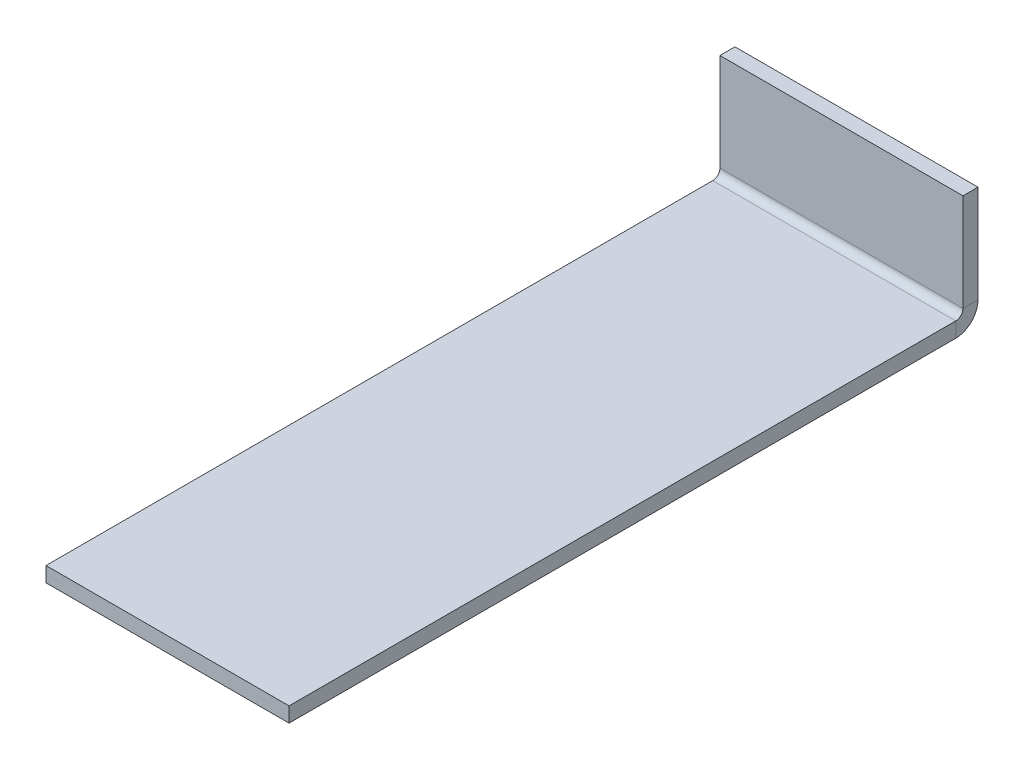
ISO-10303-21;
HEADER;
FILE_DESCRIPTION(('STEP AP214'),'2;1');
FILE_NAME('part.step','',(''),(''),'','','');
FILE_SCHEMA(('AUTOMOTIVE_DESIGN { 1 0 10303 214 1 1 1 1 }'));
ENDSEC;
DATA;
#1=APPLICATION_CONTEXT('core data for automotive mechanical design processes');
#2=APPLICATION_PROTOCOL_DEFINITION('international standard','automotive_design',2000,#1);
#3=PRODUCT_CONTEXT('',#1,'mechanical');
#4=PRODUCT('Part','Part','',(#3));
#5=PRODUCT_RELATED_PRODUCT_CATEGORY('part','',(#4));
#6=PRODUCT_DEFINITION_FORMATION('','',#4);
#7=PRODUCT_DEFINITION_CONTEXT('part definition',#1,'design');
#8=PRODUCT_DEFINITION('design','',#6,#7);
#9=PRODUCT_DEFINITION_SHAPE('','',#8);
#10=(LENGTH_UNIT() NAMED_UNIT(*) SI_UNIT(.MILLI.,.METRE.));
#11=(NAMED_UNIT(*) PLANE_ANGLE_UNIT() SI_UNIT($,.RADIAN.));
#12=(NAMED_UNIT(*) SI_UNIT($,.STERADIAN.) SOLID_ANGLE_UNIT());
#13=UNCERTAINTY_MEASURE_WITH_UNIT(LENGTH_MEASURE(1.E-05),#10,'distance_accuracy_value','');
#14=(GEOMETRIC_REPRESENTATION_CONTEXT(3) GLOBAL_UNCERTAINTY_ASSIGNED_CONTEXT((#13)) GLOBAL_UNIT_ASSIGNED_CONTEXT((#10,
#11,#12)) REPRESENTATION_CONTEXT('',''));
#15=CARTESIAN_POINT('',(0.,0.,0.));
#16=DIRECTION('',(0.,0.,1.));
#17=DIRECTION('',(1.,0.,0.));
#18=AXIS2_PLACEMENT_3D('',#15,#16,#17);
#19=CARTESIAN_POINT('',(0.,-34.3567953753348,-33.4760000000001));
#20=DIRECTION('',(0.,0.,-1.));
#21=DIRECTION('',(0.,1.,0.));
#22=AXIS2_PLACEMENT_3D('',#19,#20,#21);
#23=PLANE('',#22);
#24=DIRECTION('',(0.,-1.,0.));
#25=VECTOR('',#24,1.);
#26=CARTESIAN_POINT('',(-12.3483241152013,-69.3567953753348,-33.4760000000003));
#27=LINE('',#26,#25);
#28=CARTESIAN_POINT('',(-12.3483241152013,10.6432046246652,-33.476));
#29=VERTEX_POINT('',#28);
#30=CARTESIAN_POINT('',(-12.3483241152013,0.736599999999983,-33.476));
#31=VERTEX_POINT('',#30);
#32=EDGE_CURVE('E85',#29,#31,#27,.T.);
#33=ORIENTED_EDGE('',*,*,#32,.T.);
#34=DIRECTION('',(1.,0.,0.));
#35=VECTOR('',#34,1.);
#36=CARTESIAN_POINT('',(0.,0.736599999999997,-33.476));
#37=LINE('',#36,#35);
#38=CARTESIAN_POINT('',(12.3483241152013,0.736599999999997,-33.476));
#39=VERTEX_POINT('',#38);
#40=EDGE_CURVE('E77',#31,#39,#37,.T.);
#41=ORIENTED_EDGE('',*,*,#40,.T.);
#42=DIRECTION('',(0.,1.,0.));
#43=VECTOR('',#42,1.);
#44=CARTESIAN_POINT('',(12.3483241152013,0.643204624665154,-33.476));
#45=LINE('',#44,#43);
#46=CARTESIAN_POINT('',(12.3483241152013,10.6432046246652,-33.476));
#47=VERTEX_POINT('',#46);
#48=EDGE_CURVE('E93',#39,#47,#45,.T.);
#49=ORIENTED_EDGE('',*,*,#48,.T.);
#50=DIRECTION('',(-1.,0.,0.));
#51=VECTOR('',#50,1.);
#52=CARTESIAN_POINT('',(-12.3483241152013,10.6432046246652,-33.476));
#53=LINE('',#52,#51);
#54=EDGE_CURVE('E195',#47,#29,#53,.T.);
#55=ORIENTED_EDGE('',*,*,#54,.T.);
#56=EDGE_LOOP('',(#33,#41,#49,#55));
#57=FACE_BOUND('',#56,.T.);
#58=ADVANCED_FACE('F68',(#57),#23,.F.);
#59=CARTESIAN_POINT('',(-12.3483241152013,10.6432046246652,-35.));
#60=DIRECTION('',(0.,1.,0.));
#61=DIRECTION('',(-1.,0.,0.));
#62=AXIS2_PLACEMENT_3D('',#59,#60,#61);
#63=PLANE('',#62);
#64=ORIENTED_EDGE('',*,*,#54,.F.);
#65=DIRECTION('',(0.,0.,1.));
#66=VECTOR('',#65,1.);
#67=CARTESIAN_POINT('',(12.3483241152013,10.6432046246652,-35.));
#68=LINE('',#67,#66);
#69=CARTESIAN_POINT('',(12.3483241152013,10.6432046246652,-35.));
#70=VERTEX_POINT('',#69);
#71=EDGE_CURVE('E194',#70,#47,#68,.T.);
#72=ORIENTED_EDGE('',*,*,#71,.F.);
#73=DIRECTION('',(-1.,0.,0.));
#74=VECTOR('',#73,1.);
#75=CARTESIAN_POINT('',(-12.3483241152013,10.6432046246652,-35.));
#76=LINE('',#75,#74);
#77=CARTESIAN_POINT('',(-12.3483241152013,10.6432046246652,-35.));
#78=VERTEX_POINT('',#77);
#79=EDGE_CURVE('E191',#70,#78,#76,.T.);
#80=ORIENTED_EDGE('',*,*,#79,.T.);
#81=DIRECTION('',(0.,0.,1.));
#82=VECTOR('',#81,1.);
#83=CARTESIAN_POINT('',(-12.3483241152013,10.6432046246652,-35.));
#84=LINE('',#83,#82);
#85=EDGE_CURVE('E198',#78,#29,#84,.T.);
#86=ORIENTED_EDGE('',*,*,#85,.T.);
#87=EDGE_LOOP('',(#64,#72,#80,#86));
#88=FACE_BOUND('',#87,.T.);
#89=ADVANCED_FACE('F239',(#88),#63,.T.);
#90=CARTESIAN_POINT('',(12.3483241152013,0.643204624665161,-35.));
#91=DIRECTION('',(1.,0.,0.));
#92=DIRECTION('',(0.,1.,0.));
#93=AXIS2_PLACEMENT_3D('',#90,#91,#92);
#94=PLANE('',#93);
#95=DIRECTION('',(0.,0.,1.));
#96=VECTOR('',#95,1.);
#97=CARTESIAN_POINT('',(12.3483241152013,0.736600000000004,-35.));
#98=LINE('',#97,#96);
#99=CARTESIAN_POINT('',(12.3483241152013,0.736600000000018,-35.));
#100=VERTEX_POINT('',#99);
#101=EDGE_CURVE('E204',#100,#39,#98,.T.);
#102=ORIENTED_EDGE('',*,*,#101,.F.);
#103=DIRECTION('',(0.,1.,0.));
#104=VECTOR('',#103,1.);
#105=CARTESIAN_POINT('',(12.3483241152013,-69.3567953753348,-35.0000000000003));
#106=LINE('',#105,#104);
#107=EDGE_CURVE('E72',#100,#70,#106,.T.);
#108=ORIENTED_EDGE('',*,*,#107,.T.);
#109=ORIENTED_EDGE('',*,*,#71,.T.);
#110=ORIENTED_EDGE('',*,*,#48,.F.);
#111=EDGE_LOOP('',(#102,#108,#109,#110));
#112=FACE_BOUND('',#111,.T.);
#113=ADVANCED_FACE('F243',(#112),#94,.T.);
#114=CARTESIAN_POINT('',(-12.3483241152013,-69.3567953753348,-35.0000000000003));
#115=DIRECTION('',(-1.,0.,0.));
#116=DIRECTION('',(0.,-1.,0.));
#117=AXIS2_PLACEMENT_3D('',#114,#115,#116);
#118=PLANE('',#117);
#119=DIRECTION('',(0.,0.,-1.));
#120=VECTOR('',#119,1.);
#121=CARTESIAN_POINT('',(-12.3483241152013,0.73659999999999,-35.));
#122=LINE('',#121,#120);
#123=CARTESIAN_POINT('',(-12.3483241152013,0.736600000000004,-35.));
#124=VERTEX_POINT('',#123);
#125=EDGE_CURVE('E12',#31,#124,#122,.T.);
#126=ORIENTED_EDGE('',*,*,#125,.F.);
#127=ORIENTED_EDGE('',*,*,#32,.F.);
#128=ORIENTED_EDGE('',*,*,#85,.F.);
#129=DIRECTION('',(0.,-1.,0.));
#130=VECTOR('',#129,1.);
#131=CARTESIAN_POINT('',(-12.3483241152013,0.643204624665161,-35.));
#132=LINE('',#131,#130);
#133=EDGE_CURVE('E197',#78,#124,#132,.T.);
#134=ORIENTED_EDGE('',*,*,#133,.T.);
#135=EDGE_LOOP('',(#126,#127,#128,#134));
#136=FACE_BOUND('',#135,.T.);
#137=ADVANCED_FACE('F70',(#136),#118,.T.);
#138=CARTESIAN_POINT('',(0.,-34.3567953753348,-35.0000000000001));
#139=DIRECTION('',(0.,0.,-1.));
#140=DIRECTION('',(0.,1.,0.));
#141=AXIS2_PLACEMENT_3D('',#138,#139,#140);
#142=PLANE('',#141);
#143=DIRECTION('',(1.,0.,0.));
#144=VECTOR('',#143,1.);
#145=CARTESIAN_POINT('',(0.,0.736600000000004,-35.));
#146=LINE('',#145,#144);
#147=EDGE_CURVE('E201',#124,#100,#146,.T.);
#148=ORIENTED_EDGE('',*,*,#147,.F.);
#149=ORIENTED_EDGE('',*,*,#133,.F.);
#150=ORIENTED_EDGE('',*,*,#79,.F.);
#151=ORIENTED_EDGE('',*,*,#107,.F.);
#152=EDGE_LOOP('',(#148,#149,#150,#151));
#153=FACE_BOUND('',#152,.T.);
#154=ADVANCED_FACE('F228',(#153),#142,.T.);
#155=CARTESIAN_POINT('',(-12.3483241152013,-1.524,35.));
#156=DIRECTION('',(0.,0.,1.));
#157=DIRECTION('',(1.,0.,0.));
#158=AXIS2_PLACEMENT_3D('',#155,#156,#157);
#159=PLANE('',#158);
#160=DIRECTION('',(1.,0.,0.));
#161=VECTOR('',#160,1.);
#162=CARTESIAN_POINT('',(-12.3483241152013,0.,35.));
#163=LINE('',#162,#161);
#164=CARTESIAN_POINT('',(-12.3483241152013,0.,35.));
#165=VERTEX_POINT('',#164);
#166=CARTESIAN_POINT('',(12.3483241152013,0.,35.));
#167=VERTEX_POINT('',#166);
#168=EDGE_CURVE('E175',#165,#167,#163,.T.);
#169=ORIENTED_EDGE('',*,*,#168,.F.);
#170=DIRECTION('',(0.,1.,0.));
#171=VECTOR('',#170,1.);
#172=CARTESIAN_POINT('',(-12.3483241152013,-1.524,35.));
#173=LINE('',#172,#171);
#174=CARTESIAN_POINT('',(-12.3483241152013,-1.524,35.));
#175=VERTEX_POINT('',#174);
#176=EDGE_CURVE('E166',#175,#165,#173,.T.);
#177=ORIENTED_EDGE('',*,*,#176,.F.);
#178=DIRECTION('',(1.,0.,0.));
#179=VECTOR('',#178,1.);
#180=CARTESIAN_POINT('',(-12.3483241152013,-1.524,35.));
#181=LINE('',#180,#179);
#182=CARTESIAN_POINT('',(12.3483241152013,-1.524,35.));
#183=VERTEX_POINT('',#182);
#184=EDGE_CURVE('E162',#175,#183,#181,.T.);
#185=ORIENTED_EDGE('',*,*,#184,.T.);
#186=DIRECTION('',(0.,1.,0.));
#187=VECTOR('',#186,1.);
#188=CARTESIAN_POINT('',(12.3483241152013,-1.524,35.));
#189=LINE('',#188,#187);
#190=EDGE_CURVE('E156',#183,#167,#189,.T.);
#191=ORIENTED_EDGE('',*,*,#190,.T.);
#192=EDGE_LOOP('',(#169,#177,#185,#191));
#193=FACE_BOUND('',#192,.T.);
#194=ADVANCED_FACE('F226',(#193),#159,.T.);
#195=CARTESIAN_POINT('',(0.,-1.524,0.));
#196=DIRECTION('',(0.,-1.,0.));
#197=DIRECTION('',(0.,0.,-1.));
#198=AXIS2_PLACEMENT_3D('',#195,#196,#197);
#199=PLANE('',#198);
#200=DIRECTION('',(0.,0.,1.));
#201=VECTOR('',#200,1.);
#202=CARTESIAN_POINT('',(-12.3483241152013,-1.524,-35.));
#203=LINE('',#202,#201);
#204=CARTESIAN_POINT('',(-12.3483241152013,-1.524,-32.7394));
#205=VERTEX_POINT('',#204);
#206=EDGE_CURVE('E159',#205,#175,#203,.T.);
#207=ORIENTED_EDGE('',*,*,#206,.F.);
#208=DIRECTION('',(1.,0.,0.));
#209=VECTOR('',#208,1.);
#210=CARTESIAN_POINT('',(0.,-1.524,-32.7394));
#211=LINE('',#210,#209);
#212=CARTESIAN_POINT('',(12.3483241152013,-1.524,-32.7394));
#213=VERTEX_POINT('',#212);
#214=EDGE_CURVE('E148',#205,#213,#211,.T.);
#215=ORIENTED_EDGE('',*,*,#214,.T.);
#216=DIRECTION('',(0.,0.,-1.));
#217=VECTOR('',#216,1.);
#218=CARTESIAN_POINT('',(12.3483241152013,-1.524,35.));
#219=LINE('',#218,#217);
#220=EDGE_CURVE('E155',#183,#213,#219,.T.);
#221=ORIENTED_EDGE('',*,*,#220,.F.);
#222=ORIENTED_EDGE('',*,*,#184,.F.);
#223=EDGE_LOOP('',(#207,#215,#221,#222));
#224=FACE_BOUND('',#223,.T.);
#225=ADVANCED_FACE('F160',(#224),#199,.T.);
#226=CARTESIAN_POINT('',(12.3483241152013,-1.524,-35.));
#227=DIRECTION('',(1.,0.,0.));
#228=DIRECTION('',(0.,0.,-1.));
#229=AXIS2_PLACEMENT_3D('',#226,#227,#228);
#230=PLANE('',#229);
#231=ORIENTED_EDGE('',*,*,#220,.T.);
#232=DIRECTION('',(0.,1.,0.));
#233=VECTOR('',#232,1.);
#234=CARTESIAN_POINT('',(12.3483241152013,-1.524,-32.7394));
#235=LINE('',#234,#233);
#236=CARTESIAN_POINT('',(12.3483241152013,0.,-32.7394));
#237=VERTEX_POINT('',#236);
#238=EDGE_CURVE('E182',#213,#237,#235,.T.);
#239=ORIENTED_EDGE('',*,*,#238,.T.);
#240=DIRECTION('',(0.,0.,-1.));
#241=VECTOR('',#240,1.);
#242=CARTESIAN_POINT('',(12.3483241152013,0.,-35.));
#243=LINE('',#242,#241);
#244=EDGE_CURVE('E172',#167,#237,#243,.T.);
#245=ORIENTED_EDGE('',*,*,#244,.F.);
#246=ORIENTED_EDGE('',*,*,#190,.F.);
#247=EDGE_LOOP('',(#231,#239,#245,#246));
#248=FACE_BOUND('',#247,.T.);
#249=ADVANCED_FACE('F224',(#248),#230,.T.);
#250=CARTESIAN_POINT('',(0.,0.,0.));
#251=DIRECTION('',(0.,-1.,0.));
#252=DIRECTION('',(0.,0.,-1.));
#253=AXIS2_PLACEMENT_3D('',#250,#251,#252);
#254=PLANE('',#253);
#255=DIRECTION('',(1.,0.,0.));
#256=VECTOR('',#255,1.);
#257=CARTESIAN_POINT('',(0.,0.,-32.7394));
#258=LINE('',#257,#256);
#259=CARTESIAN_POINT('',(-12.3483241152013,0.,-32.7394));
#260=VERTEX_POINT('',#259);
#261=EDGE_CURVE('E189',#260,#237,#258,.T.);
#262=ORIENTED_EDGE('',*,*,#261,.F.);
#263=DIRECTION('',(0.,0.,1.));
#264=VECTOR('',#263,1.);
#265=CARTESIAN_POINT('',(-12.3483241152013,0.,35.));
#266=LINE('',#265,#264);
#267=EDGE_CURVE('E170',#260,#165,#266,.T.);
#268=ORIENTED_EDGE('',*,*,#267,.T.);
#269=ORIENTED_EDGE('',*,*,#168,.T.);
#270=ORIENTED_EDGE('',*,*,#244,.T.);
#271=EDGE_LOOP('',(#262,#268,#269,#270));
#272=FACE_BOUND('',#271,.T.);
#273=ADVANCED_FACE('F222',(#272),#254,.F.);
#274=CARTESIAN_POINT('',(-12.3483241152013,-1.524,35.));
#275=DIRECTION('',(-1.,0.,0.));
#276=DIRECTION('',(0.,0.,1.));
#277=AXIS2_PLACEMENT_3D('',#274,#275,#276);
#278=PLANE('',#277);
#279=ORIENTED_EDGE('',*,*,#267,.F.);
#280=DIRECTION('',(0.,-1.,0.));
#281=VECTOR('',#280,1.);
#282=CARTESIAN_POINT('',(-12.3483241152013,-1.524,-32.7394));
#283=LINE('',#282,#281);
#284=EDGE_CURVE('E139',#260,#205,#283,.T.);
#285=ORIENTED_EDGE('',*,*,#284,.T.);
#286=ORIENTED_EDGE('',*,*,#206,.T.);
#287=ORIENTED_EDGE('',*,*,#176,.T.);
#288=EDGE_LOOP('',(#279,#285,#286,#287));
#289=FACE_BOUND('',#288,.T.);
#290=ADVANCED_FACE('F169',(#289),#278,.T.);
#291=CARTESIAN_POINT('',(-12.3483241152013,0.7366,-32.7394));
#292=DIRECTION('',(-1.,0.,0.));
#293=DIRECTION('',(0.,0.,1.));
#294=AXIS2_PLACEMENT_3D('',#291,#292,#293);
#295=PLANE('',#294);
#296=ORIENTED_EDGE('',*,*,#284,.F.);
#297=CARTESIAN_POINT('',(-12.3483241152013,0.7366,-32.7394));
#298=DIRECTION('',(1.,0.,0.));
#299=DIRECTION('',(0.,0.,-1.));
#300=AXIS2_PLACEMENT_3D('',#297,#298,#299);
#301=CIRCLE('',#300,0.7366);
#302=EDGE_CURVE('E212',#260,#31,#301,.T.);
#303=ORIENTED_EDGE('',*,*,#302,.T.);
#304=ORIENTED_EDGE('',*,*,#125,.T.);
#305=CARTESIAN_POINT('',(-12.3483241152013,0.7366,-32.7394));
#306=DIRECTION('',(1.,0.,0.));
#307=DIRECTION('',(0.,0.,1.));
#308=AXIS2_PLACEMENT_3D('',#305,#306,#307);
#309=CIRCLE('',#308,2.2606);
#310=EDGE_CURVE('E134',#205,#124,#309,.T.);
#311=ORIENTED_EDGE('',*,*,#310,.F.);
#312=EDGE_LOOP('',(#296,#303,#304,#311));
#313=FACE_BOUND('',#312,.T.);
#314=ADVANCED_FACE('F136',(#313),#295,.T.);
#315=CARTESIAN_POINT('',(12.3483241152013,0.7366,-32.7394));
#316=DIRECTION('',(1.,0.,0.));
#317=DIRECTION('',(0.,0.,-1.));
#318=AXIS2_PLACEMENT_3D('',#315,#316,#317);
#319=PLANE('',#318);
#320=ORIENTED_EDGE('',*,*,#101,.T.);
#321=CARTESIAN_POINT('',(12.3483241152013,0.7366,-32.7394));
#322=DIRECTION('',(1.,0.,0.));
#323=DIRECTION('',(0.,0.,-1.));
#324=AXIS2_PLACEMENT_3D('',#321,#322,#323);
#325=CIRCLE('',#324,0.7366);
#326=EDGE_CURVE('E144',#39,#237,#325,.F.);
#327=ORIENTED_EDGE('',*,*,#326,.T.);
#328=ORIENTED_EDGE('',*,*,#238,.F.);
#329=CARTESIAN_POINT('',(12.3483241152013,0.7366,-32.7394));
#330=DIRECTION('',(-1.,0.,0.));
#331=DIRECTION('',(0.,0.,-1.));
#332=AXIS2_PLACEMENT_3D('',#329,#330,#331);
#333=CIRCLE('',#332,2.2606);
#334=EDGE_CURVE('E143',#100,#213,#333,.T.);
#335=ORIENTED_EDGE('',*,*,#334,.F.);
#336=EDGE_LOOP('',(#320,#327,#328,#335));
#337=FACE_BOUND('',#336,.T.);
#338=ADVANCED_FACE('F218',(#337),#319,.T.);
#339=CARTESIAN_POINT('',(-24.8553475944985,0.7366,-32.7394));
#340=DIRECTION('',(1.,0.,0.));
#341=DIRECTION('',(0.,0.,-1.));
#342=AXIS2_PLACEMENT_3D('',#339,#340,#341);
#343=CYLINDRICAL_SURFACE('',#342,2.2606);
#344=ORIENTED_EDGE('',*,*,#334,.T.);
#345=ORIENTED_EDGE('',*,*,#214,.F.);
#346=ORIENTED_EDGE('',*,*,#310,.T.);
#347=ORIENTED_EDGE('',*,*,#147,.T.);
#348=EDGE_LOOP('',(#344,#345,#346,#347));
#349=FACE_BOUND('',#348,.T.);
#350=ADVANCED_FACE('F150',(#349),#343,.T.);
#351=CARTESIAN_POINT('',(-24.8553475944985,0.7366,-32.7394));
#352=DIRECTION('',(1.,0.,0.));
#353=DIRECTION('',(0.,0.,-1.));
#354=AXIS2_PLACEMENT_3D('',#351,#352,#353);
#355=CYLINDRICAL_SURFACE('',#354,0.7366);
#356=ORIENTED_EDGE('',*,*,#326,.F.);
#357=ORIENTED_EDGE('',*,*,#40,.F.);
#358=ORIENTED_EDGE('',*,*,#302,.F.);
#359=ORIENTED_EDGE('',*,*,#261,.T.);
#360=EDGE_LOOP('',(#356,#357,#358,#359));
#361=FACE_BOUND('',#360,.T.);
#362=ADVANCED_FACE('F295',(#361),#355,.F.);
#363=CLOSED_SHELL('',(#58,#89,#113,#137,#154,#194,#225,#249,#273,#290,#314,#338,#350,#362));
#364=MANIFOLD_SOLID_BREP('B2',#363);
#365=ADVANCED_BREP_SHAPE_REPRESENTATION('',(#18,#364),#14);
#366=SHAPE_DEFINITION_REPRESENTATION(#9,#365);
ENDSEC;
END-ISO-10303-21;
